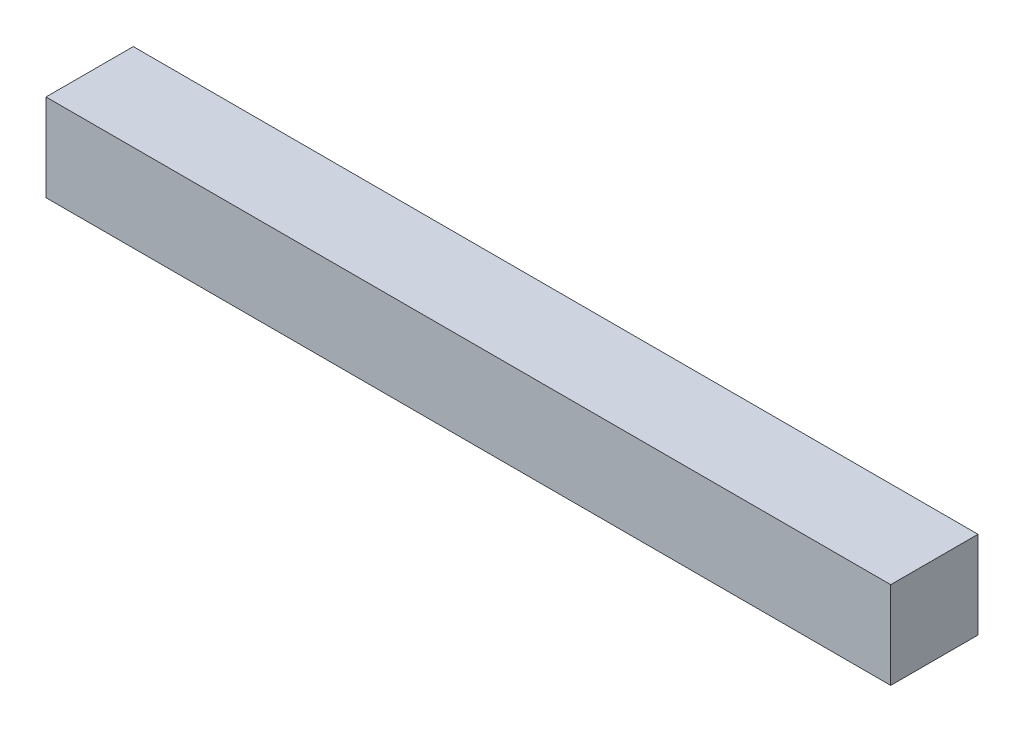
ISO-10303-21;
HEADER;
FILE_DESCRIPTION(('STEP AP214'),'2;1');
FILE_NAME('part.step','',(''),(''),'','','');
FILE_SCHEMA(('AUTOMOTIVE_DESIGN { 1 0 10303 214 1 1 1 1 }'));
ENDSEC;
DATA;
#1=APPLICATION_CONTEXT('core data for automotive mechanical design processes');
#2=APPLICATION_PROTOCOL_DEFINITION('international standard','automotive_design',2000,#1);
#3=PRODUCT_CONTEXT('',#1,'mechanical');
#4=PRODUCT('Part','Part','',(#3));
#5=PRODUCT_RELATED_PRODUCT_CATEGORY('part','',(#4));
#6=PRODUCT_DEFINITION_FORMATION('','',#4);
#7=PRODUCT_DEFINITION_CONTEXT('part definition',#1,'design');
#8=PRODUCT_DEFINITION('design','',#6,#7);
#9=PRODUCT_DEFINITION_SHAPE('','',#8);
#10=(LENGTH_UNIT() NAMED_UNIT(*) SI_UNIT(.MILLI.,.METRE.));
#11=(NAMED_UNIT(*) PLANE_ANGLE_UNIT() SI_UNIT($,.RADIAN.));
#12=(NAMED_UNIT(*) SI_UNIT($,.STERADIAN.) SOLID_ANGLE_UNIT());
#13=UNCERTAINTY_MEASURE_WITH_UNIT(LENGTH_MEASURE(1.E-05),#10,'distance_accuracy_value','');
#14=(GEOMETRIC_REPRESENTATION_CONTEXT(3) GLOBAL_UNCERTAINTY_ASSIGNED_CONTEXT((#13)) GLOBAL_UNIT_ASSIGNED_CONTEXT((#10,
#11,#12)) REPRESENTATION_CONTEXT('',''));
#15=CARTESIAN_POINT('',(0.,0.,0.));
#16=DIRECTION('',(0.,0.,1.));
#17=DIRECTION('',(1.,0.,0.));
#18=AXIS2_PLACEMENT_3D('',#15,#16,#17);
#19=CARTESIAN_POINT('',(0.,0.,10.));
#20=DIRECTION('',(1.,0.,0.));
#21=DIRECTION('',(0.,0.,-1.));
#22=AXIS2_PLACEMENT_3D('',#19,#20,#21);
#23=PLANE('',#22);
#24=DIRECTION('',(0.,-1.,0.));
#25=VECTOR('',#24,1.);
#26=CARTESIAN_POINT('',(0.,0.,0.));
#27=LINE('',#26,#25);
#28=CARTESIAN_POINT('',(0.,0.,0.));
#29=VERTEX_POINT('',#28);
#30=CARTESIAN_POINT('',(0.,-10.,0.));
#31=VERTEX_POINT('',#30);
#32=EDGE_CURVE('E107',#29,#31,#27,.T.);
#33=ORIENTED_EDGE('',*,*,#32,.T.);
#34=DIRECTION('',(0.,0.,-1.));
#35=VECTOR('',#34,1.);
#36=CARTESIAN_POINT('',(0.,-10.,10.));
#37=LINE('',#36,#35);
#38=CARTESIAN_POINT('',(0.,-10.,10.));
#39=VERTEX_POINT('',#38);
#40=EDGE_CURVE('E11',#39,#31,#37,.T.);
#41=ORIENTED_EDGE('',*,*,#40,.F.);
#42=DIRECTION('',(0.,-1.,0.));
#43=VECTOR('',#42,1.);
#44=CARTESIAN_POINT('',(0.,0.,10.));
#45=LINE('',#44,#43);
#46=CARTESIAN_POINT('',(0.,0.,10.));
#47=VERTEX_POINT('',#46);
#48=EDGE_CURVE('E91',#47,#39,#45,.T.);
#49=ORIENTED_EDGE('',*,*,#48,.F.);
#50=DIRECTION('',(0.,0.,-1.));
#51=VECTOR('',#50,1.);
#52=CARTESIAN_POINT('',(0.,0.,10.));
#53=LINE('',#52,#51);
#54=EDGE_CURVE('E103',#47,#29,#53,.T.);
#55=ORIENTED_EDGE('',*,*,#54,.T.);
#56=EDGE_LOOP('',(#33,#41,#49,#55));
#57=FACE_BOUND('',#56,.T.);
#58=ADVANCED_FACE('F39',(#57),#23,.F.);
#59=CARTESIAN_POINT('',(0.,-10.,10.));
#60=DIRECTION('',(0.,1.,0.));
#61=DIRECTION('',(0.,0.,1.));
#62=AXIS2_PLACEMENT_3D('',#59,#60,#61);
#63=PLANE('',#62);
#64=DIRECTION('',(1.,0.,0.));
#65=VECTOR('',#64,1.);
#66=CARTESIAN_POINT('',(0.,-10.,0.));
#67=LINE('',#66,#65);
#68=CARTESIAN_POINT('',(96.79,-10.,0.));
#69=VERTEX_POINT('',#68);
#70=EDGE_CURVE('E96',#31,#69,#67,.T.);
#71=ORIENTED_EDGE('',*,*,#70,.T.);
#72=DIRECTION('',(0.,0.,-1.));
#73=VECTOR('',#72,1.);
#74=CARTESIAN_POINT('',(96.79,-10.,10.));
#75=LINE('',#74,#73);
#76=CARTESIAN_POINT('',(96.79,-10.,10.));
#77=VERTEX_POINT('',#76);
#78=EDGE_CURVE('E48',#77,#69,#75,.T.);
#79=ORIENTED_EDGE('',*,*,#78,.F.);
#80=DIRECTION('',(1.,0.,0.));
#81=VECTOR('',#80,1.);
#82=CARTESIAN_POINT('',(0.,-10.,10.));
#83=LINE('',#82,#81);
#84=EDGE_CURVE('E86',#39,#77,#83,.T.);
#85=ORIENTED_EDGE('',*,*,#84,.F.);
#86=ORIENTED_EDGE('',*,*,#40,.T.);
#87=EDGE_LOOP('',(#71,#79,#85,#86));
#88=FACE_BOUND('',#87,.T.);
#89=ADVANCED_FACE('F95',(#88),#63,.F.);
#90=CARTESIAN_POINT('',(96.79,0.,10.));
#91=DIRECTION('',(-1.,0.,0.));
#92=DIRECTION('',(0.,0.,1.));
#93=AXIS2_PLACEMENT_3D('',#90,#91,#92);
#94=PLANE('',#93);
#95=DIRECTION('',(0.,1.,0.));
#96=VECTOR('',#95,1.);
#97=CARTESIAN_POINT('',(96.79,0.,0.));
#98=LINE('',#97,#96);
#99=CARTESIAN_POINT('',(96.79,0.,0.));
#100=VERTEX_POINT('',#99);
#101=EDGE_CURVE('E73',#69,#100,#98,.T.);
#102=ORIENTED_EDGE('',*,*,#101,.T.);
#103=DIRECTION('',(0.,0.,-1.));
#104=VECTOR('',#103,1.);
#105=CARTESIAN_POINT('',(96.79,0.,10.));
#106=LINE('',#105,#104);
#107=CARTESIAN_POINT('',(96.79,0.,10.));
#108=VERTEX_POINT('',#107);
#109=EDGE_CURVE('E98',#108,#100,#106,.T.);
#110=ORIENTED_EDGE('',*,*,#109,.F.);
#111=DIRECTION('',(0.,1.,0.));
#112=VECTOR('',#111,1.);
#113=CARTESIAN_POINT('',(96.79,0.,10.));
#114=LINE('',#113,#112);
#115=EDGE_CURVE('E89',#77,#108,#114,.T.);
#116=ORIENTED_EDGE('',*,*,#115,.F.);
#117=ORIENTED_EDGE('',*,*,#78,.T.);
#118=EDGE_LOOP('',(#102,#110,#116,#117));
#119=FACE_BOUND('',#118,.T.);
#120=ADVANCED_FACE('F99',(#119),#94,.F.);
#121=CARTESIAN_POINT('',(0.,0.,10.));
#122=DIRECTION('',(0.,-1.,0.));
#123=DIRECTION('',(0.,0.,-1.));
#124=AXIS2_PLACEMENT_3D('',#121,#122,#123);
#125=PLANE('',#124);
#126=DIRECTION('',(-1.,0.,0.));
#127=VECTOR('',#126,1.);
#128=CARTESIAN_POINT('',(0.,0.,0.));
#129=LINE('',#128,#127);
#130=EDGE_CURVE('E79',#100,#29,#129,.T.);
#131=ORIENTED_EDGE('',*,*,#130,.T.);
#132=ORIENTED_EDGE('',*,*,#54,.F.);
#133=DIRECTION('',(-1.,0.,0.));
#134=VECTOR('',#133,1.);
#135=CARTESIAN_POINT('',(0.,0.,10.));
#136=LINE('',#135,#134);
#137=EDGE_CURVE('E56',#108,#47,#136,.T.);
#138=ORIENTED_EDGE('',*,*,#137,.F.);
#139=ORIENTED_EDGE('',*,*,#109,.T.);
#140=EDGE_LOOP('',(#131,#132,#138,#139));
#141=FACE_BOUND('',#140,.T.);
#142=ADVANCED_FACE('F120',(#141),#125,.F.);
#143=CARTESIAN_POINT('',(0.,0.,10.));
#144=DIRECTION('',(0.,0.,1.));
#145=DIRECTION('',(1.,0.,0.));
#146=AXIS2_PLACEMENT_3D('',#143,#144,#145);
#147=PLANE('',#146);
#148=ORIENTED_EDGE('',*,*,#48,.T.);
#149=ORIENTED_EDGE('',*,*,#84,.T.);
#150=ORIENTED_EDGE('',*,*,#115,.T.);
#151=ORIENTED_EDGE('',*,*,#137,.T.);
#152=EDGE_LOOP('',(#148,#149,#150,#151));
#153=FACE_BOUND('',#152,.T.);
#154=ADVANCED_FACE('F87',(#153),#147,.T.);
#155=CARTESIAN_POINT('',(0.,0.,0.));
#156=DIRECTION('',(0.,0.,1.));
#157=DIRECTION('',(1.,0.,0.));
#158=AXIS2_PLACEMENT_3D('',#155,#156,#157);
#159=PLANE('',#158);
#160=ORIENTED_EDGE('',*,*,#32,.F.);
#161=ORIENTED_EDGE('',*,*,#130,.F.);
#162=ORIENTED_EDGE('',*,*,#101,.F.);
#163=ORIENTED_EDGE('',*,*,#70,.F.);
#164=EDGE_LOOP('',(#160,#161,#162,#163));
#165=FACE_BOUND('',#164,.T.);
#166=ADVANCED_FACE('F123',(#165),#159,.F.);
#167=CLOSED_SHELL('',(#58,#89,#120,#142,#154,#166));
#168=MANIFOLD_SOLID_BREP('B2',#167);
#169=ADVANCED_BREP_SHAPE_REPRESENTATION('',(#18,#168),#14);
#170=SHAPE_DEFINITION_REPRESENTATION(#9,#169);
ENDSEC;
END-ISO-10303-21;
